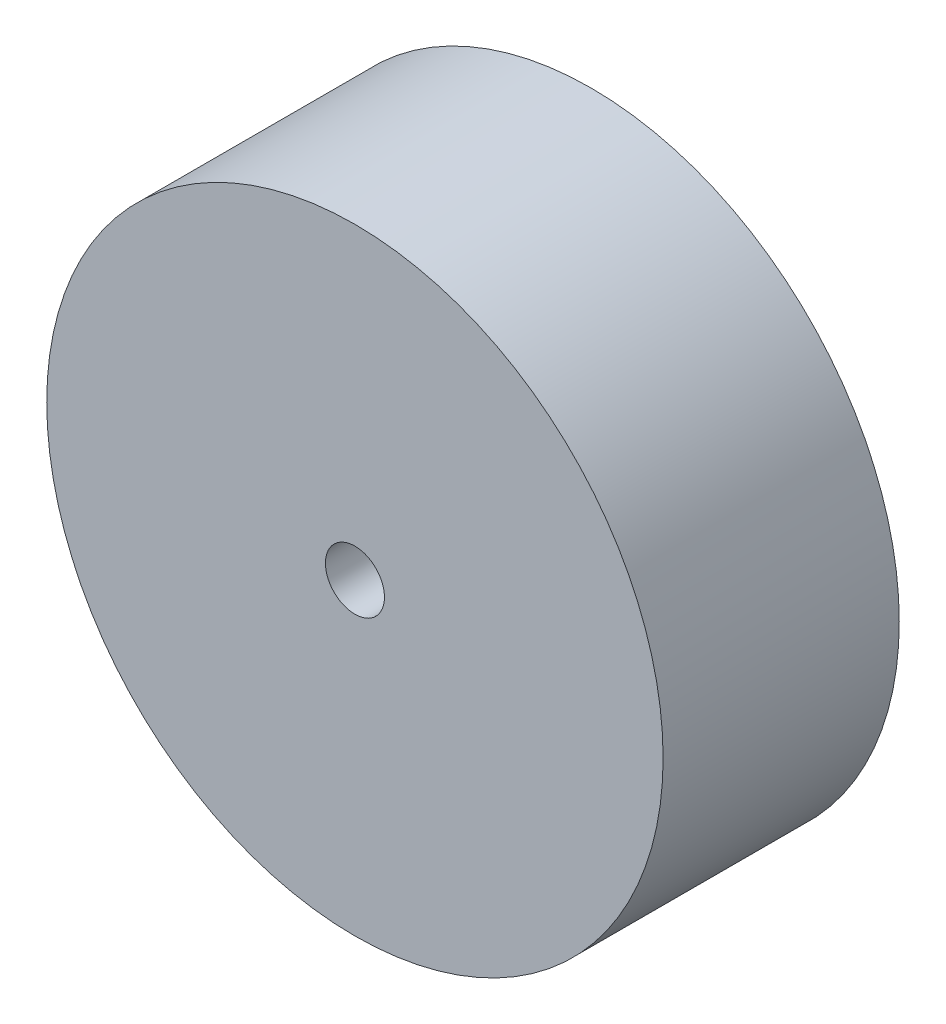
ISO-10303-21;
HEADER;
FILE_DESCRIPTION(('STEP AP214'),'2;1');
FILE_NAME('part.step','',(''),(''),'','','');
FILE_SCHEMA(('AUTOMOTIVE_DESIGN { 1 0 10303 214 1 1 1 1 }'));
ENDSEC;
DATA;
#1=APPLICATION_CONTEXT('core data for automotive mechanical design processes');
#2=APPLICATION_PROTOCOL_DEFINITION('international standard','automotive_design',2000,#1);
#3=PRODUCT_CONTEXT('',#1,'mechanical');
#4=PRODUCT('Part','Part','',(#3));
#5=PRODUCT_RELATED_PRODUCT_CATEGORY('part','',(#4));
#6=PRODUCT_DEFINITION_FORMATION('','',#4);
#7=PRODUCT_DEFINITION_CONTEXT('part definition',#1,'design');
#8=PRODUCT_DEFINITION('design','',#6,#7);
#9=PRODUCT_DEFINITION_SHAPE('','',#8);
#10=(LENGTH_UNIT() NAMED_UNIT(*) SI_UNIT(.MILLI.,.METRE.));
#11=(NAMED_UNIT(*) PLANE_ANGLE_UNIT() SI_UNIT($,.RADIAN.));
#12=(NAMED_UNIT(*) SI_UNIT($,.STERADIAN.) SOLID_ANGLE_UNIT());
#13=UNCERTAINTY_MEASURE_WITH_UNIT(LENGTH_MEASURE(1.E-05),#10,'distance_accuracy_value','');
#14=(GEOMETRIC_REPRESENTATION_CONTEXT(3) GLOBAL_UNCERTAINTY_ASSIGNED_CONTEXT((#13)) GLOBAL_UNIT_ASSIGNED_CONTEXT((#10,
#11,#12)) REPRESENTATION_CONTEXT('',''));
#15=CARTESIAN_POINT('',(0.,0.,0.));
#16=DIRECTION('',(0.,0.,1.));
#17=DIRECTION('',(1.,0.,0.));
#18=AXIS2_PLACEMENT_3D('',#15,#16,#17);
#19=CARTESIAN_POINT('',(0.,0.,25.4));
#20=DIRECTION('',(0.,0.,-1.));
#21=DIRECTION('',(-1.,0.,0.));
#22=AXIS2_PLACEMENT_3D('',#19,#20,#21);
#23=CYLINDRICAL_SURFACE('',#22,33.1492772390306);
#24=CARTESIAN_POINT('',(0.,0.,25.4));
#25=DIRECTION('',(0.,0.,1.));
#26=DIRECTION('',(1.,0.,0.));
#27=AXIS2_PLACEMENT_3D('',#24,#25,#26);
#28=CIRCLE('',#27,33.1492772390306);
#29=CARTESIAN_POINT('',(33.1492772390306,0.,25.4));
#30=VERTEX_POINT('',#29);
#31=EDGE_CURVE('E10',#30,#30,#28,.T.);
#32=ORIENTED_EDGE('',*,*,#31,.F.);
#33=EDGE_LOOP('',(#32));
#34=FACE_BOUND('',#33,.T.);
#35=CARTESIAN_POINT('',(0.,0.,0.));
#36=DIRECTION('',(0.,0.,1.));
#37=DIRECTION('',(1.,0.,0.));
#38=AXIS2_PLACEMENT_3D('',#35,#36,#37);
#39=CIRCLE('',#38,33.1492772390306);
#40=CARTESIAN_POINT('',(33.1492772390306,0.,0.));
#41=VERTEX_POINT('',#40);
#42=EDGE_CURVE('E40',#41,#41,#39,.T.);
#43=ORIENTED_EDGE('',*,*,#42,.T.);
#44=EDGE_LOOP('',(#43));
#45=FACE_BOUND('',#44,.T.);
#46=ADVANCED_FACE('F37',(#34,#45),#23,.T.);
#47=CARTESIAN_POINT('',(0.,0.,25.4));
#48=DIRECTION('',(0.,0.,1.));
#49=DIRECTION('',(1.,0.,0.));
#50=AXIS2_PLACEMENT_3D('',#47,#48,#49);
#51=PLANE('',#50);
#52=CARTESIAN_POINT('',(0.,0.,25.4));
#53=DIRECTION('',(0.,0.,1.));
#54=DIRECTION('',(1.,0.,0.));
#55=AXIS2_PLACEMENT_3D('',#52,#53,#54);
#56=CIRCLE('',#55,3.17499999999999);
#57=CARTESIAN_POINT('',(3.17499999999999,0.,25.4));
#58=VERTEX_POINT('',#57);
#59=EDGE_CURVE('E54',#58,#58,#56,.T.);
#60=ORIENTED_EDGE('',*,*,#59,.F.);
#61=EDGE_LOOP('',(#60));
#62=FACE_BOUND('',#61,.T.);
#63=ORIENTED_EDGE('',*,*,#31,.T.);
#64=EDGE_LOOP('',(#63));
#65=FACE_BOUND('',#64,.T.);
#66=ADVANCED_FACE('F61',(#62,#65),#51,.T.);
#67=CARTESIAN_POINT('',(0.,0.,0.));
#68=DIRECTION('',(0.,0.,1.));
#69=DIRECTION('',(1.,0.,0.));
#70=AXIS2_PLACEMENT_3D('',#67,#68,#69);
#71=PLANE('',#70);
#72=CARTESIAN_POINT('',(0.,0.,0.));
#73=DIRECTION('',(0.,0.,1.));
#74=DIRECTION('',(1.,0.,0.));
#75=AXIS2_PLACEMENT_3D('',#72,#73,#74);
#76=CIRCLE('',#75,3.17499999999997);
#77=CARTESIAN_POINT('',(3.17499999999997,0.,0.));
#78=VERTEX_POINT('',#77);
#79=EDGE_CURVE('E49',#78,#78,#76,.T.);
#80=ORIENTED_EDGE('',*,*,#79,.T.);
#81=EDGE_LOOP('',(#80));
#82=FACE_BOUND('',#81,.T.);
#83=ORIENTED_EDGE('',*,*,#42,.F.);
#84=EDGE_LOOP('',(#83));
#85=FACE_BOUND('',#84,.T.);
#86=ADVANCED_FACE('F63',(#82,#85),#71,.F.);
#87=CARTESIAN_POINT('',(0.,0.,25.4));
#88=DIRECTION('',(0.,0.,1.));
#89=DIRECTION('',(1.,0.,0.));
#90=AXIS2_PLACEMENT_3D('',#87,#88,#89);
#91=CYLINDRICAL_SURFACE('',#90,3.17499999999998);
#92=ORIENTED_EDGE('',*,*,#79,.F.);
#93=EDGE_LOOP('',(#92));
#94=FACE_BOUND('',#93,.T.);
#95=ORIENTED_EDGE('',*,*,#59,.T.);
#96=EDGE_LOOP('',(#95));
#97=FACE_BOUND('',#96,.T.);
#98=ADVANCED_FACE('F59',(#94,#97),#91,.F.);
#99=CLOSED_SHELL('',(#46,#66,#86,#98));
#100=MANIFOLD_SOLID_BREP('B2',#99);
#101=ADVANCED_BREP_SHAPE_REPRESENTATION('',(#18,#100),#14);
#102=SHAPE_DEFINITION_REPRESENTATION(#9,#101);
ENDSEC;
END-ISO-10303-21;
